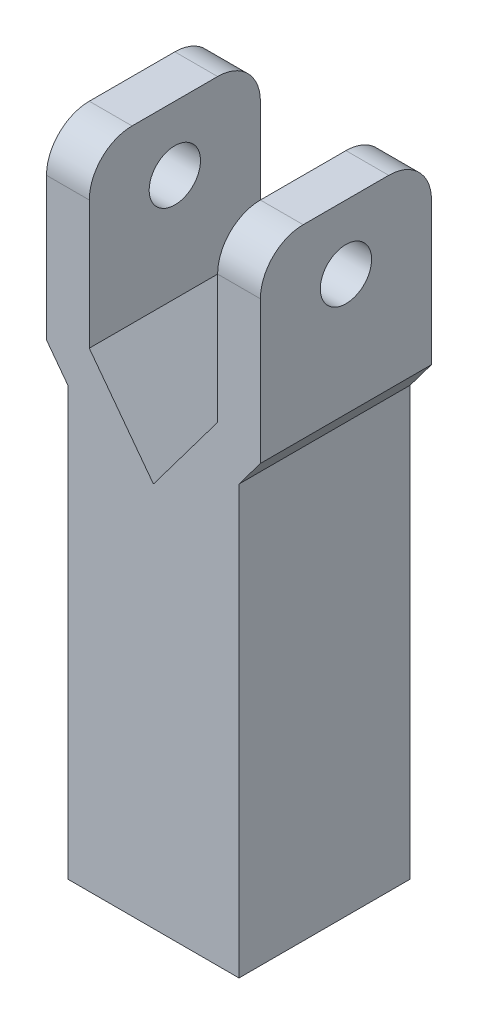
ISO-10303-21;
HEADER;
FILE_DESCRIPTION(('STEP AP214'),'2;1');
FILE_NAME('part.step','',(''),(''),'','','');
FILE_SCHEMA(('AUTOMOTIVE_DESIGN { 1 0 10303 214 1 1 1 1 }'));
ENDSEC;
DATA;
#1=APPLICATION_CONTEXT('core data for automotive mechanical design processes');
#2=APPLICATION_PROTOCOL_DEFINITION('international standard','automotive_design',2000,#1);
#3=PRODUCT_CONTEXT('',#1,'mechanical');
#4=PRODUCT('Part','Part','',(#3));
#5=PRODUCT_RELATED_PRODUCT_CATEGORY('part','',(#4));
#6=PRODUCT_DEFINITION_FORMATION('','',#4);
#7=PRODUCT_DEFINITION_CONTEXT('part definition',#1,'design');
#8=PRODUCT_DEFINITION('design','',#6,#7);
#9=PRODUCT_DEFINITION_SHAPE('','',#8);
#10=(LENGTH_UNIT() NAMED_UNIT(*) SI_UNIT(.MILLI.,.METRE.));
#11=(NAMED_UNIT(*) PLANE_ANGLE_UNIT() SI_UNIT($,.RADIAN.));
#12=(NAMED_UNIT(*) SI_UNIT($,.STERADIAN.) SOLID_ANGLE_UNIT());
#13=UNCERTAINTY_MEASURE_WITH_UNIT(LENGTH_MEASURE(1.E-05),#10,'distance_accuracy_value','');
#14=(GEOMETRIC_REPRESENTATION_CONTEXT(3) GLOBAL_UNCERTAINTY_ASSIGNED_CONTEXT((#13)) GLOBAL_UNIT_ASSIGNED_CONTEXT((#10,
#11,#12)) REPRESENTATION_CONTEXT('',''));
#15=CARTESIAN_POINT('',(0.,0.,0.));
#16=DIRECTION('',(0.,0.,1.));
#17=DIRECTION('',(1.,0.,0.));
#18=AXIS2_PLACEMENT_3D('',#15,#16,#17);
#19=CARTESIAN_POINT('',(-15.,150.,20.));
#20=DIRECTION('',(0.,-1.,0.));
#21=DIRECTION('',(0.,0.,-1.));
#22=AXIS2_PLACEMENT_3D('',#19,#20,#21);
#23=PLANE('',#22);
#24=DIRECTION('',(0.,0.,-1.));
#25=VECTOR('',#24,1.);
#26=CARTESIAN_POINT('',(-15.,150.,20.));
#27=LINE('',#26,#25);
#28=CARTESIAN_POINT('',(-15.,150.,10.));
#29=VERTEX_POINT('',#28);
#30=CARTESIAN_POINT('',(-15.,150.,-10.));
#31=VERTEX_POINT('',#30);
#32=EDGE_CURVE('E212',#29,#31,#27,.T.);
#33=ORIENTED_EDGE('',*,*,#32,.T.);
#34=DIRECTION('',(-1.,0.,0.));
#35=VECTOR('',#34,1.);
#36=CARTESIAN_POINT('',(-15.,150.,-10.));
#37=LINE('',#36,#35);
#38=CARTESIAN_POINT('',(-25.,150.,-10.));
#39=VERTEX_POINT('',#38);
#40=EDGE_CURVE('E265',#31,#39,#37,.T.);
#41=ORIENTED_EDGE('',*,*,#40,.T.);
#42=DIRECTION('',(0.,0.,-1.));
#43=VECTOR('',#42,1.);
#44=CARTESIAN_POINT('',(-25.,150.,20.));
#45=LINE('',#44,#43);
#46=CARTESIAN_POINT('',(-25.,150.,10.));
#47=VERTEX_POINT('',#46);
#48=EDGE_CURVE('E237',#47,#39,#45,.T.);
#49=ORIENTED_EDGE('',*,*,#48,.F.);
#50=DIRECTION('',(-1.,0.,0.));
#51=VECTOR('',#50,1.);
#52=CARTESIAN_POINT('',(-15.,150.,10.));
#53=LINE('',#52,#51);
#54=EDGE_CURVE('E56',#47,#29,#53,.F.);
#55=ORIENTED_EDGE('',*,*,#54,.T.);
#56=EDGE_LOOP('',(#33,#41,#49,#55));
#57=FACE_BOUND('',#56,.T.);
#58=ADVANCED_FACE('F36',(#57),#23,.F.);
#59=CARTESIAN_POINT('',(-25.,150.,20.));
#60=DIRECTION('',(1.,0.,0.));
#61=DIRECTION('',(0.,1.,0.));
#62=AXIS2_PLACEMENT_3D('',#59,#60,#61);
#63=PLANE('',#62);
#64=CARTESIAN_POINT('',(-25.,135.,0.));
#65=DIRECTION('',(-1.,0.,0.));
#66=DIRECTION('',(0.,-1.,0.));
#67=AXIS2_PLACEMENT_3D('',#64,#65,#66);
#68=CIRCLE('',#67,6.);
#69=CARTESIAN_POINT('',(-25.,129.,0.));
#70=VERTEX_POINT('',#69);
#71=EDGE_CURVE('E184',#70,#70,#68,.T.);
#72=ORIENTED_EDGE('',*,*,#71,.F.);
#73=EDGE_LOOP('',(#72));
#74=FACE_BOUND('',#73,.T.);
#75=ORIENTED_EDGE('',*,*,#48,.T.);
#76=CARTESIAN_POINT('',(-25.,140.,-10.));
#77=DIRECTION('',(1.,0.,0.));
#78=DIRECTION('',(0.,1.,0.));
#79=AXIS2_PLACEMENT_3D('',#76,#77,#78);
#80=CIRCLE('',#79,10.);
#81=CARTESIAN_POINT('',(-25.,140.,-20.));
#82=VERTEX_POINT('',#81);
#83=EDGE_CURVE('E270',#39,#82,#80,.F.);
#84=ORIENTED_EDGE('',*,*,#83,.T.);
#85=DIRECTION('',(0.,-1.,0.));
#86=VECTOR('',#85,1.);
#87=CARTESIAN_POINT('',(-25.,150.,-20.));
#88=LINE('',#87,#86);
#89=CARTESIAN_POINT('',(-25.,106.666666666667,-20.));
#90=VERTEX_POINT('',#89);
#91=EDGE_CURVE('E213',#82,#90,#88,.T.);
#92=ORIENTED_EDGE('',*,*,#91,.T.);
#93=DIRECTION('',(0.,0.,-1.));
#94=VECTOR('',#93,1.);
#95=CARTESIAN_POINT('',(-25.,106.666666666667,20.));
#96=LINE('',#95,#94);
#97=CARTESIAN_POINT('',(-25.,106.666666666667,20.));
#98=VERTEX_POINT('',#97);
#99=EDGE_CURVE('E234',#98,#90,#96,.T.);
#100=ORIENTED_EDGE('',*,*,#99,.F.);
#101=DIRECTION('',(0.,-1.,0.));
#102=VECTOR('',#101,1.);
#103=CARTESIAN_POINT('',(-25.,150.,20.));
#104=LINE('',#103,#102);
#105=CARTESIAN_POINT('',(-25.,140.,20.));
#106=VERTEX_POINT('',#105);
#107=EDGE_CURVE('E198',#106,#98,#104,.T.);
#108=ORIENTED_EDGE('',*,*,#107,.F.);
#109=CARTESIAN_POINT('',(-25.,140.,10.));
#110=DIRECTION('',(1.,0.,0.));
#111=DIRECTION('',(0.,1.,0.));
#112=AXIS2_PLACEMENT_3D('',#109,#110,#111);
#113=CIRCLE('',#112,10.);
#114=EDGE_CURVE('E268',#106,#47,#113,.F.);
#115=ORIENTED_EDGE('',*,*,#114,.T.);
#116=EDGE_LOOP('',(#75,#84,#92,#100,#108,#115));
#117=FACE_BOUND('',#116,.T.);
#118=ADVANCED_FACE('F280',(#74,#117),#63,.F.);
#119=CARTESIAN_POINT('',(-25.,106.666666666667,20.));
#120=DIRECTION('',(0.800000000000001,0.599999999999999,0.));
#121=DIRECTION('',(-0.599999999999999,0.800000000000001,0.));
#122=AXIS2_PLACEMENT_3D('',#119,#120,#121);
#123=PLANE('',#122);
#124=DIRECTION('',(0.599999999999999,-0.800000000000001,0.));
#125=VECTOR('',#124,1.);
#126=CARTESIAN_POINT('',(-25.,106.666666666667,-20.));
#127=LINE('',#126,#125);
#128=CARTESIAN_POINT('',(-20.,100.,-20.));
#129=VERTEX_POINT('',#128);
#130=EDGE_CURVE('E215',#90,#129,#127,.T.);
#131=ORIENTED_EDGE('',*,*,#130,.T.);
#132=DIRECTION('',(0.,0.,-1.));
#133=VECTOR('',#132,1.);
#134=CARTESIAN_POINT('',(-20.,100.,20.));
#135=LINE('',#134,#133);
#136=CARTESIAN_POINT('',(-20.,100.,20.));
#137=VERTEX_POINT('',#136);
#138=EDGE_CURVE('E231',#137,#129,#135,.T.);
#139=ORIENTED_EDGE('',*,*,#138,.F.);
#140=DIRECTION('',(0.599999999999999,-0.800000000000001,0.));
#141=VECTOR('',#140,1.);
#142=CARTESIAN_POINT('',(-25.,106.666666666667,20.));
#143=LINE('',#142,#141);
#144=EDGE_CURVE('E200',#98,#137,#143,.T.);
#145=ORIENTED_EDGE('',*,*,#144,.F.);
#146=ORIENTED_EDGE('',*,*,#99,.T.);
#147=EDGE_LOOP('',(#131,#139,#145,#146));
#148=FACE_BOUND('',#147,.T.);
#149=ADVANCED_FACE('F296',(#148),#123,.F.);
#150=CARTESIAN_POINT('',(-20.,100.,20.));
#151=DIRECTION('',(1.,0.,0.));
#152=DIRECTION('',(0.,1.,0.));
#153=AXIS2_PLACEMENT_3D('',#150,#151,#152);
#154=PLANE('',#153);
#155=DIRECTION('',(0.,-1.,0.));
#156=VECTOR('',#155,1.);
#157=CARTESIAN_POINT('',(-20.,100.,-20.));
#158=LINE('',#157,#156);
#159=CARTESIAN_POINT('',(-20.,0.,-20.));
#160=VERTEX_POINT('',#159);
#161=EDGE_CURVE('E217',#129,#160,#158,.T.);
#162=ORIENTED_EDGE('',*,*,#161,.T.);
#163=DIRECTION('',(0.,0.,-1.));
#164=VECTOR('',#163,1.);
#165=CARTESIAN_POINT('',(-20.,0.,20.));
#166=LINE('',#165,#164);
#167=CARTESIAN_POINT('',(-20.,0.,20.));
#168=VERTEX_POINT('',#167);
#169=EDGE_CURVE('E228',#168,#160,#166,.T.);
#170=ORIENTED_EDGE('',*,*,#169,.F.);
#171=DIRECTION('',(0.,-1.,0.));
#172=VECTOR('',#171,1.);
#173=CARTESIAN_POINT('',(-20.,100.,20.));
#174=LINE('',#173,#172);
#175=EDGE_CURVE('E203',#137,#168,#174,.T.);
#176=ORIENTED_EDGE('',*,*,#175,.F.);
#177=ORIENTED_EDGE('',*,*,#138,.T.);
#178=EDGE_LOOP('',(#162,#170,#176,#177));
#179=FACE_BOUND('',#178,.T.);
#180=ADVANCED_FACE('F300',(#179),#154,.F.);
#181=CARTESIAN_POINT('',(-20.,0.,20.));
#182=DIRECTION('',(0.,1.,0.));
#183=DIRECTION('',(0.,0.,1.));
#184=AXIS2_PLACEMENT_3D('',#181,#182,#183);
#185=PLANE('',#184);
#186=DIRECTION('',(1.,0.,0.));
#187=VECTOR('',#186,1.);
#188=CARTESIAN_POINT('',(-20.,0.,-20.));
#189=LINE('',#188,#187);
#190=CARTESIAN_POINT('',(20.,0.,-20.));
#191=VERTEX_POINT('',#190);
#192=EDGE_CURVE('E219',#160,#191,#189,.T.);
#193=ORIENTED_EDGE('',*,*,#192,.T.);
#194=DIRECTION('',(0.,0.,-1.));
#195=VECTOR('',#194,1.);
#196=CARTESIAN_POINT('',(20.,0.,20.));
#197=LINE('',#196,#195);
#198=CARTESIAN_POINT('',(20.,0.,20.));
#199=VERTEX_POINT('',#198);
#200=EDGE_CURVE('E186',#199,#191,#197,.T.);
#201=ORIENTED_EDGE('',*,*,#200,.F.);
#202=DIRECTION('',(1.,0.,0.));
#203=VECTOR('',#202,1.);
#204=CARTESIAN_POINT('',(-20.,0.,20.));
#205=LINE('',#204,#203);
#206=EDGE_CURVE('E205',#168,#199,#205,.T.);
#207=ORIENTED_EDGE('',*,*,#206,.F.);
#208=ORIENTED_EDGE('',*,*,#169,.T.);
#209=EDGE_LOOP('',(#193,#201,#207,#208));
#210=FACE_BOUND('',#209,.T.);
#211=ADVANCED_FACE('F306',(#210),#185,.F.);
#212=CARTESIAN_POINT('',(-15.,110.,20.));
#213=DIRECTION('',(-0.8,-0.599999999999999,0.));
#214=DIRECTION('',(0.6,-0.800000000000001,0.));
#215=AXIS2_PLACEMENT_3D('',#212,#213,#214);
#216=PLANE('',#215);
#217=DIRECTION('',(-0.599999999999999,0.8,0.));
#218=VECTOR('',#217,1.);
#219=CARTESIAN_POINT('',(-15.,110.,-20.));
#220=LINE('',#219,#218);
#221=CARTESIAN_POINT('',(0.,90.,-20.));
#222=VERTEX_POINT('',#221);
#223=CARTESIAN_POINT('',(-15.,110.,-20.));
#224=VERTEX_POINT('',#223);
#225=EDGE_CURVE('E221',#222,#224,#220,.T.);
#226=ORIENTED_EDGE('',*,*,#225,.T.);
#227=DIRECTION('',(0.,0.,-1.));
#228=VECTOR('',#227,1.);
#229=CARTESIAN_POINT('',(-15.,110.,20.));
#230=LINE('',#229,#228);
#231=CARTESIAN_POINT('',(-15.,110.,20.));
#232=VERTEX_POINT('',#231);
#233=EDGE_CURVE('E225',#232,#224,#230,.T.);
#234=ORIENTED_EDGE('',*,*,#233,.F.);
#235=DIRECTION('',(-0.599999999999999,0.8,0.));
#236=VECTOR('',#235,1.);
#237=CARTESIAN_POINT('',(-15.,110.,20.));
#238=LINE('',#237,#236);
#239=CARTESIAN_POINT('',(0.,90.,20.));
#240=VERTEX_POINT('',#239);
#241=EDGE_CURVE('E207',#240,#232,#238,.T.);
#242=ORIENTED_EDGE('',*,*,#241,.F.);
#243=DIRECTION('',(0.,0.,-1.));
#244=VECTOR('',#243,1.);
#245=CARTESIAN_POINT('',(0.,90.,20.));
#246=LINE('',#245,#244);
#247=EDGE_CURVE('E309',#240,#222,#246,.T.);
#248=ORIENTED_EDGE('',*,*,#247,.T.);
#249=EDGE_LOOP('',(#226,#234,#242,#248));
#250=FACE_BOUND('',#249,.T.);
#251=ADVANCED_FACE('F336',(#250),#216,.F.);
#252=CARTESIAN_POINT('',(-15.,150.,20.));
#253=DIRECTION('',(-1.,0.,0.));
#254=DIRECTION('',(0.,-1.,0.));
#255=AXIS2_PLACEMENT_3D('',#252,#253,#254);
#256=PLANE('',#255);
#257=CARTESIAN_POINT('',(-15.,135.,0.));
#258=DIRECTION('',(-1.,0.,0.));
#259=DIRECTION('',(0.,-1.,0.));
#260=AXIS2_PLACEMENT_3D('',#257,#258,#259);
#261=CIRCLE('',#260,6.);
#262=CARTESIAN_POINT('',(-15.,129.,0.));
#263=VERTEX_POINT('',#262);
#264=EDGE_CURVE('E197',#263,#263,#261,.T.);
#265=ORIENTED_EDGE('',*,*,#264,.T.);
#266=EDGE_LOOP('',(#265));
#267=FACE_BOUND('',#266,.T.);
#268=DIRECTION('',(0.,1.,0.));
#269=VECTOR('',#268,1.);
#270=CARTESIAN_POINT('',(-15.,150.,-20.));
#271=LINE('',#270,#269);
#272=CARTESIAN_POINT('',(-15.,140.,-20.));
#273=VERTEX_POINT('',#272);
#274=EDGE_CURVE('E201',#224,#273,#271,.T.);
#275=ORIENTED_EDGE('',*,*,#274,.T.);
#276=CARTESIAN_POINT('',(-15.,140.,-10.));
#277=DIRECTION('',(-1.,0.,0.));
#278=DIRECTION('',(0.,-1.,0.));
#279=AXIS2_PLACEMENT_3D('',#276,#277,#278);
#280=CIRCLE('',#279,10.);
#281=EDGE_CURVE('E11',#273,#31,#280,.F.);
#282=ORIENTED_EDGE('',*,*,#281,.T.);
#283=ORIENTED_EDGE('',*,*,#32,.F.);
#284=CARTESIAN_POINT('',(-15.,140.,10.));
#285=DIRECTION('',(-1.,0.,0.));
#286=DIRECTION('',(0.,-1.,0.));
#287=AXIS2_PLACEMENT_3D('',#284,#285,#286);
#288=CIRCLE('',#287,10.);
#289=CARTESIAN_POINT('',(-15.,140.,20.));
#290=VERTEX_POINT('',#289);
#291=EDGE_CURVE('E44',#29,#290,#288,.F.);
#292=ORIENTED_EDGE('',*,*,#291,.T.);
#293=DIRECTION('',(0.,1.,0.));
#294=VECTOR('',#293,1.);
#295=CARTESIAN_POINT('',(-15.,150.,20.));
#296=LINE('',#295,#294);
#297=EDGE_CURVE('E209',#232,#290,#296,.T.);
#298=ORIENTED_EDGE('',*,*,#297,.F.);
#299=ORIENTED_EDGE('',*,*,#233,.T.);
#300=EDGE_LOOP('',(#275,#282,#283,#292,#298,#299));
#301=FACE_BOUND('',#300,.T.);
#302=ADVANCED_FACE('F273',(#267,#301),#256,.F.);
#303=CARTESIAN_POINT('',(-25.,150.,20.));
#304=DIRECTION('',(0.,0.,1.));
#305=DIRECTION('',(1.,0.,0.));
#306=AXIS2_PLACEMENT_3D('',#303,#304,#305);
#307=PLANE('',#306);
#308=DIRECTION('',(0.,-1.,0.));
#309=VECTOR('',#308,1.);
#310=CARTESIAN_POINT('',(25.,150.,20.));
#311=LINE('',#310,#309);
#312=CARTESIAN_POINT('',(25.,140.,20.));
#313=VERTEX_POINT('',#312);
#314=CARTESIAN_POINT('',(25.,106.666666666667,20.));
#315=VERTEX_POINT('',#314);
#316=EDGE_CURVE('E155',#313,#315,#311,.T.);
#317=ORIENTED_EDGE('',*,*,#316,.F.);
#318=DIRECTION('',(1.,0.,0.));
#319=VECTOR('',#318,1.);
#320=CARTESIAN_POINT('',(15.,140.,20.));
#321=LINE('',#320,#319);
#322=CARTESIAN_POINT('',(15.,140.,20.));
#323=VERTEX_POINT('',#322);
#324=EDGE_CURVE('E262',#313,#323,#321,.F.);
#325=ORIENTED_EDGE('',*,*,#324,.T.);
#326=DIRECTION('',(0.,1.,0.));
#327=VECTOR('',#326,1.);
#328=CARTESIAN_POINT('',(15.,150.,20.));
#329=LINE('',#328,#327);
#330=CARTESIAN_POINT('',(15.,110.,20.));
#331=VERTEX_POINT('',#330);
#332=EDGE_CURVE('E314',#331,#323,#329,.T.);
#333=ORIENTED_EDGE('',*,*,#332,.F.);
#334=DIRECTION('',(0.599999999999999,0.8,0.));
#335=VECTOR('',#334,1.);
#336=CARTESIAN_POINT('',(15.,110.,20.));
#337=LINE('',#336,#335);
#338=EDGE_CURVE('E311',#240,#331,#337,.T.);
#339=ORIENTED_EDGE('',*,*,#338,.F.);
#340=ORIENTED_EDGE('',*,*,#241,.T.);
#341=ORIENTED_EDGE('',*,*,#297,.T.);
#342=DIRECTION('',(-1.,0.,0.));
#343=VECTOR('',#342,1.);
#344=CARTESIAN_POINT('',(-25.,140.,20.));
#345=LINE('',#344,#343);
#346=EDGE_CURVE('E259',#290,#106,#345,.T.);
#347=ORIENTED_EDGE('',*,*,#346,.T.);
#348=ORIENTED_EDGE('',*,*,#107,.T.);
#349=ORIENTED_EDGE('',*,*,#144,.T.);
#350=ORIENTED_EDGE('',*,*,#175,.T.);
#351=ORIENTED_EDGE('',*,*,#206,.T.);
#352=DIRECTION('',(0.,-1.,0.));
#353=VECTOR('',#352,1.);
#354=CARTESIAN_POINT('',(20.,100.,20.));
#355=LINE('',#354,#353);
#356=CARTESIAN_POINT('',(20.,100.,20.));
#357=VERTEX_POINT('',#356);
#358=EDGE_CURVE('E171',#357,#199,#355,.T.);
#359=ORIENTED_EDGE('',*,*,#358,.F.);
#360=DIRECTION('',(-0.599999999999999,-0.800000000000001,0.));
#361=VECTOR('',#360,1.);
#362=CARTESIAN_POINT('',(25.,106.666666666667,20.));
#363=LINE('',#362,#361);
#364=EDGE_CURVE('E165',#315,#357,#363,.T.);
#365=ORIENTED_EDGE('',*,*,#364,.F.);
#366=EDGE_LOOP('',(#317,#325,#333,#339,#340,#341,#347,#348,#349,#350,#351,#359,#365));
#367=FACE_BOUND('',#366,.T.);
#368=ADVANCED_FACE('F169',(#367),#307,.T.);
#369=CARTESIAN_POINT('',(-25.,150.,-20.));
#370=DIRECTION('',(0.,0.,1.));
#371=DIRECTION('',(1.,0.,0.));
#372=AXIS2_PLACEMENT_3D('',#369,#370,#371);
#373=PLANE('',#372);
#374=DIRECTION('',(0.,1.,0.));
#375=VECTOR('',#374,1.);
#376=CARTESIAN_POINT('',(15.,150.,-20.));
#377=LINE('',#376,#375);
#378=CARTESIAN_POINT('',(15.,110.,-20.));
#379=VERTEX_POINT('',#378);
#380=CARTESIAN_POINT('',(15.,140.,-20.));
#381=VERTEX_POINT('',#380);
#382=EDGE_CURVE('E166',#379,#381,#377,.T.);
#383=ORIENTED_EDGE('',*,*,#382,.T.);
#384=DIRECTION('',(1.,0.,0.));
#385=VECTOR('',#384,1.);
#386=CARTESIAN_POINT('',(-25.,140.,-20.));
#387=LINE('',#386,#385);
#388=CARTESIAN_POINT('',(25.,140.,-20.));
#389=VERTEX_POINT('',#388);
#390=EDGE_CURVE('E244',#381,#389,#387,.T.);
#391=ORIENTED_EDGE('',*,*,#390,.T.);
#392=DIRECTION('',(0.,-1.,0.));
#393=VECTOR('',#392,1.);
#394=CARTESIAN_POINT('',(25.,150.,-20.));
#395=LINE('',#394,#393);
#396=CARTESIAN_POINT('',(25.,106.666666666667,-20.));
#397=VERTEX_POINT('',#396);
#398=EDGE_CURVE('E193',#389,#397,#395,.T.);
#399=ORIENTED_EDGE('',*,*,#398,.T.);
#400=DIRECTION('',(-0.599999999999999,-0.800000000000001,0.));
#401=VECTOR('',#400,1.);
#402=CARTESIAN_POINT('',(25.,106.666666666667,-20.));
#403=LINE('',#402,#401);
#404=CARTESIAN_POINT('',(20.,100.,-20.));
#405=VERTEX_POINT('',#404);
#406=EDGE_CURVE('E179',#397,#405,#403,.T.);
#407=ORIENTED_EDGE('',*,*,#406,.T.);
#408=DIRECTION('',(0.,-1.,0.));
#409=VECTOR('',#408,1.);
#410=CARTESIAN_POINT('',(20.,100.,-20.));
#411=LINE('',#410,#409);
#412=EDGE_CURVE('E322',#405,#191,#411,.T.);
#413=ORIENTED_EDGE('',*,*,#412,.T.);
#414=ORIENTED_EDGE('',*,*,#192,.F.);
#415=ORIENTED_EDGE('',*,*,#161,.F.);
#416=ORIENTED_EDGE('',*,*,#130,.F.);
#417=ORIENTED_EDGE('',*,*,#91,.F.);
#418=DIRECTION('',(-1.,0.,0.));
#419=VECTOR('',#418,1.);
#420=CARTESIAN_POINT('',(-25.,140.,-20.));
#421=LINE('',#420,#419);
#422=EDGE_CURVE('E240',#82,#273,#421,.F.);
#423=ORIENTED_EDGE('',*,*,#422,.T.);
#424=ORIENTED_EDGE('',*,*,#274,.F.);
#425=ORIENTED_EDGE('',*,*,#225,.F.);
#426=DIRECTION('',(0.599999999999999,0.8,0.));
#427=VECTOR('',#426,1.);
#428=CARTESIAN_POINT('',(15.,110.,-20.));
#429=LINE('',#428,#427);
#430=EDGE_CURVE('E324',#222,#379,#429,.T.);
#431=ORIENTED_EDGE('',*,*,#430,.T.);
#432=EDGE_LOOP('',(#383,#391,#399,#407,#413,#414,#415,#416,#417,#423,#424,#425,#431));
#433=FACE_BOUND('',#432,.T.);
#434=ADVANCED_FACE('F290',(#433),#373,.F.);
#435=CARTESIAN_POINT('',(15.,135.,0.));
#436=DIRECTION('',(-1.,0.,0.));
#437=DIRECTION('',(0.,-1.,0.));
#438=AXIS2_PLACEMENT_3D('',#435,#436,#437);
#439=CYLINDRICAL_SURFACE('',#438,6.);
#440=ORIENTED_EDGE('',*,*,#71,.T.);
#441=EDGE_LOOP('',(#440));
#442=FACE_BOUND('',#441,.T.);
#443=ORIENTED_EDGE('',*,*,#264,.F.);
#444=EDGE_LOOP('',(#443));
#445=FACE_BOUND('',#444,.T.);
#446=ADVANCED_FACE('F384',(#442,#445),#439,.F.);
#447=CARTESIAN_POINT('',(15.,150.,20.));
#448=DIRECTION('',(0.,-1.,0.));
#449=DIRECTION('',(0.,0.,-1.));
#450=AXIS2_PLACEMENT_3D('',#447,#448,#449);
#451=PLANE('',#450);
#452=DIRECTION('',(0.,0.,-1.));
#453=VECTOR('',#452,1.);
#454=CARTESIAN_POINT('',(25.,150.,20.));
#455=LINE('',#454,#453);
#456=CARTESIAN_POINT('',(25.,150.,10.));
#457=VERTEX_POINT('',#456);
#458=CARTESIAN_POINT('',(25.,150.,-10.));
#459=VERTEX_POINT('',#458);
#460=EDGE_CURVE('E180',#457,#459,#455,.T.);
#461=ORIENTED_EDGE('',*,*,#460,.T.);
#462=DIRECTION('',(1.,0.,0.));
#463=VECTOR('',#462,1.);
#464=CARTESIAN_POINT('',(15.,150.,-10.));
#465=LINE('',#464,#463);
#466=CARTESIAN_POINT('',(15.,150.,-10.));
#467=VERTEX_POINT('',#466);
#468=EDGE_CURVE('E253',#459,#467,#465,.F.);
#469=ORIENTED_EDGE('',*,*,#468,.T.);
#470=DIRECTION('',(0.,0.,-1.));
#471=VECTOR('',#470,1.);
#472=CARTESIAN_POINT('',(15.,150.,20.));
#473=LINE('',#472,#471);
#474=CARTESIAN_POINT('',(15.,150.,10.));
#475=VERTEX_POINT('',#474);
#476=EDGE_CURVE('E319',#475,#467,#473,.T.);
#477=ORIENTED_EDGE('',*,*,#476,.F.);
#478=DIRECTION('',(1.,0.,0.));
#479=VECTOR('',#478,1.);
#480=CARTESIAN_POINT('',(25.,150.,10.));
#481=LINE('',#480,#479);
#482=EDGE_CURVE('E250',#475,#457,#481,.T.);
#483=ORIENTED_EDGE('',*,*,#482,.T.);
#484=EDGE_LOOP('',(#461,#469,#477,#483));
#485=FACE_BOUND('',#484,.T.);
#486=ADVANCED_FACE('F350',(#485),#451,.F.);
#487=CARTESIAN_POINT('',(25.,150.,20.));
#488=DIRECTION('',(-1.,0.,0.));
#489=DIRECTION('',(0.,1.,0.));
#490=AXIS2_PLACEMENT_3D('',#487,#488,#489);
#491=PLANE('',#490);
#492=CARTESIAN_POINT('',(25.,135.,0.));
#493=DIRECTION('',(-1.,0.,0.));
#494=DIRECTION('',(0.,-1.,0.));
#495=AXIS2_PLACEMENT_3D('',#492,#493,#494);
#496=CIRCLE('',#495,6.);
#497=CARTESIAN_POINT('',(25.,129.,0.));
#498=VERTEX_POINT('',#497);
#499=EDGE_CURVE('E194',#498,#498,#496,.T.);
#500=ORIENTED_EDGE('',*,*,#499,.T.);
#501=EDGE_LOOP('',(#500));
#502=FACE_BOUND('',#501,.T.);
#503=ORIENTED_EDGE('',*,*,#398,.F.);
#504=CARTESIAN_POINT('',(25.,140.,-10.));
#505=DIRECTION('',(-1.,0.,0.));
#506=DIRECTION('',(0.,-1.,0.));
#507=AXIS2_PLACEMENT_3D('',#504,#505,#506);
#508=CIRCLE('',#507,10.);
#509=EDGE_CURVE('E248',#389,#459,#508,.F.);
#510=ORIENTED_EDGE('',*,*,#509,.T.);
#511=ORIENTED_EDGE('',*,*,#460,.F.);
#512=CARTESIAN_POINT('',(25.,140.,10.));
#513=DIRECTION('',(-1.,0.,0.));
#514=DIRECTION('',(0.,-1.,0.));
#515=AXIS2_PLACEMENT_3D('',#512,#513,#514);
#516=CIRCLE('',#515,10.);
#517=EDGE_CURVE('E162',#457,#313,#516,.F.);
#518=ORIENTED_EDGE('',*,*,#517,.T.);
#519=ORIENTED_EDGE('',*,*,#316,.T.);
#520=DIRECTION('',(0.,0.,-1.));
#521=VECTOR('',#520,1.);
#522=CARTESIAN_POINT('',(25.,106.666666666667,20.));
#523=LINE('',#522,#521);
#524=EDGE_CURVE('E160',#315,#397,#523,.T.);
#525=ORIENTED_EDGE('',*,*,#524,.T.);
#526=EDGE_LOOP('',(#503,#510,#511,#518,#519,#525));
#527=FACE_BOUND('',#526,.T.);
#528=ADVANCED_FACE('F158',(#502,#527),#491,.F.);
#529=CARTESIAN_POINT('',(25.,106.666666666667,20.));
#530=DIRECTION('',(-0.800000000000001,0.599999999999999,0.));
#531=DIRECTION('',(0.599999999999999,0.800000000000001,0.));
#532=AXIS2_PLACEMENT_3D('',#529,#530,#531);
#533=PLANE('',#532);
#534=ORIENTED_EDGE('',*,*,#406,.F.);
#535=ORIENTED_EDGE('',*,*,#524,.F.);
#536=ORIENTED_EDGE('',*,*,#364,.T.);
#537=DIRECTION('',(0.,0.,-1.));
#538=VECTOR('',#537,1.);
#539=CARTESIAN_POINT('',(20.,100.,20.));
#540=LINE('',#539,#538);
#541=EDGE_CURVE('E181',#357,#405,#540,.T.);
#542=ORIENTED_EDGE('',*,*,#541,.T.);
#543=EDGE_LOOP('',(#534,#535,#536,#542));
#544=FACE_BOUND('',#543,.T.);
#545=ADVANCED_FACE('F177',(#544),#533,.F.);
#546=CARTESIAN_POINT('',(20.,100.,20.));
#547=DIRECTION('',(-1.,0.,0.));
#548=DIRECTION('',(0.,1.,0.));
#549=AXIS2_PLACEMENT_3D('',#546,#547,#548);
#550=PLANE('',#549);
#551=ORIENTED_EDGE('',*,*,#412,.F.);
#552=ORIENTED_EDGE('',*,*,#541,.F.);
#553=ORIENTED_EDGE('',*,*,#358,.T.);
#554=ORIENTED_EDGE('',*,*,#200,.T.);
#555=EDGE_LOOP('',(#551,#552,#553,#554));
#556=FACE_BOUND('',#555,.T.);
#557=ADVANCED_FACE('F310',(#556),#550,.F.);
#558=CARTESIAN_POINT('',(15.,110.,20.));
#559=DIRECTION('',(0.8,-0.599999999999999,0.));
#560=DIRECTION('',(-0.6,-0.800000000000001,0.));
#561=AXIS2_PLACEMENT_3D('',#558,#559,#560);
#562=PLANE('',#561);
#563=ORIENTED_EDGE('',*,*,#430,.F.);
#564=ORIENTED_EDGE('',*,*,#247,.F.);
#565=ORIENTED_EDGE('',*,*,#338,.T.);
#566=DIRECTION('',(0.,0.,-1.));
#567=VECTOR('',#566,1.);
#568=CARTESIAN_POINT('',(15.,110.,20.));
#569=LINE('',#568,#567);
#570=EDGE_CURVE('E330',#331,#379,#569,.T.);
#571=ORIENTED_EDGE('',*,*,#570,.T.);
#572=EDGE_LOOP('',(#563,#564,#565,#571));
#573=FACE_BOUND('',#572,.T.);
#574=ADVANCED_FACE('F339',(#573),#562,.F.);
#575=CARTESIAN_POINT('',(15.,150.,20.));
#576=DIRECTION('',(1.,0.,0.));
#577=DIRECTION('',(0.,-1.,0.));
#578=AXIS2_PLACEMENT_3D('',#575,#576,#577);
#579=PLANE('',#578);
#580=CARTESIAN_POINT('',(15.,135.,0.));
#581=DIRECTION('',(-1.,0.,0.));
#582=DIRECTION('',(0.,-1.,0.));
#583=AXIS2_PLACEMENT_3D('',#580,#581,#582);
#584=CIRCLE('',#583,6.);
#585=CARTESIAN_POINT('',(15.,129.,0.));
#586=VERTEX_POINT('',#585);
#587=EDGE_CURVE('E190',#586,#586,#584,.T.);
#588=ORIENTED_EDGE('',*,*,#587,.F.);
#589=EDGE_LOOP('',(#588));
#590=FACE_BOUND('',#589,.T.);
#591=ORIENTED_EDGE('',*,*,#476,.T.);
#592=CARTESIAN_POINT('',(15.,140.,-10.));
#593=DIRECTION('',(1.,0.,0.));
#594=DIRECTION('',(0.,1.,0.));
#595=AXIS2_PLACEMENT_3D('',#592,#593,#594);
#596=CIRCLE('',#595,10.);
#597=EDGE_CURVE('E257',#467,#381,#596,.F.);
#598=ORIENTED_EDGE('',*,*,#597,.T.);
#599=ORIENTED_EDGE('',*,*,#382,.F.);
#600=ORIENTED_EDGE('',*,*,#570,.F.);
#601=ORIENTED_EDGE('',*,*,#332,.T.);
#602=CARTESIAN_POINT('',(15.,140.,10.));
#603=DIRECTION('',(1.,0.,0.));
#604=DIRECTION('',(0.,1.,0.));
#605=AXIS2_PLACEMENT_3D('',#602,#603,#604);
#606=CIRCLE('',#605,10.);
#607=EDGE_CURVE('E255',#323,#475,#606,.F.);
#608=ORIENTED_EDGE('',*,*,#607,.T.);
#609=EDGE_LOOP('',(#591,#598,#599,#600,#601,#608));
#610=FACE_BOUND('',#609,.T.);
#611=ADVANCED_FACE('F342',(#590,#610),#579,.F.);
#612=CARTESIAN_POINT('',(-15.,135.,0.));
#613=DIRECTION('',(1.,0.,0.));
#614=DIRECTION('',(0.,-1.,0.));
#615=AXIS2_PLACEMENT_3D('',#612,#613,#614);
#616=CYLINDRICAL_SURFACE('',#615,6.);
#617=ORIENTED_EDGE('',*,*,#499,.F.);
#618=EDGE_LOOP('',(#617));
#619=FACE_BOUND('',#618,.T.);
#620=ORIENTED_EDGE('',*,*,#587,.T.);
#621=EDGE_LOOP('',(#620));
#622=FACE_BOUND('',#621,.T.);
#623=ADVANCED_FACE('F361',(#619,#622),#616,.F.);
#624=CARTESIAN_POINT('',(-25.,140.,-10.));
#625=DIRECTION('',(1.,0.,0.));
#626=DIRECTION('',(0.,0.,-1.));
#627=AXIS2_PLACEMENT_3D('',#624,#625,#626);
#628=CYLINDRICAL_SURFACE('',#627,10.);
#629=ORIENTED_EDGE('',*,*,#597,.F.);
#630=ORIENTED_EDGE('',*,*,#468,.F.);
#631=ORIENTED_EDGE('',*,*,#509,.F.);
#632=ORIENTED_EDGE('',*,*,#390,.F.);
#633=EDGE_LOOP('',(#629,#630,#631,#632));
#634=FACE_BOUND('',#633,.T.);
#635=ADVANCED_FACE('F347',(#634),#628,.T.);
#636=CARTESIAN_POINT('',(15.,140.,10.));
#637=DIRECTION('',(-1.,0.,0.));
#638=DIRECTION('',(0.,0.,1.));
#639=AXIS2_PLACEMENT_3D('',#636,#637,#638);
#640=CYLINDRICAL_SURFACE('',#639,10.);
#641=ORIENTED_EDGE('',*,*,#607,.F.);
#642=ORIENTED_EDGE('',*,*,#324,.F.);
#643=ORIENTED_EDGE('',*,*,#517,.F.);
#644=ORIENTED_EDGE('',*,*,#482,.F.);
#645=EDGE_LOOP('',(#641,#642,#643,#644));
#646=FACE_BOUND('',#645,.T.);
#647=ADVANCED_FACE('F354',(#646),#640,.T.);
#648=CARTESIAN_POINT('',(-15.,140.,-10.));
#649=DIRECTION('',(-1.,0.,0.));
#650=DIRECTION('',(0.,0.,1.));
#651=AXIS2_PLACEMENT_3D('',#648,#649,#650);
#652=CYLINDRICAL_SURFACE('',#651,10.);
#653=ORIENTED_EDGE('',*,*,#281,.F.);
#654=ORIENTED_EDGE('',*,*,#422,.F.);
#655=ORIENTED_EDGE('',*,*,#83,.F.);
#656=ORIENTED_EDGE('',*,*,#40,.F.);
#657=EDGE_LOOP('',(#653,#654,#655,#656));
#658=FACE_BOUND('',#657,.T.);
#659=ADVANCED_FACE('F284',(#658),#652,.T.);
#660=CARTESIAN_POINT('',(-25.,140.,10.));
#661=DIRECTION('',(1.,0.,0.));
#662=DIRECTION('',(0.,0.,-1.));
#663=AXIS2_PLACEMENT_3D('',#660,#661,#662);
#664=CYLINDRICAL_SURFACE('',#663,10.);
#665=ORIENTED_EDGE('',*,*,#291,.F.);
#666=ORIENTED_EDGE('',*,*,#54,.F.);
#667=ORIENTED_EDGE('',*,*,#114,.F.);
#668=ORIENTED_EDGE('',*,*,#346,.F.);
#669=EDGE_LOOP('',(#665,#666,#667,#668));
#670=FACE_BOUND('',#669,.T.);
#671=ADVANCED_FACE('F38',(#670),#664,.T.);
#672=CLOSED_SHELL('',(#58,#118,#149,#180,#211,#251,#302,#368,#434,#446,#486,#528,#545,#557,#574,
#611,#623,#635,#647,#659,#671));
#673=MANIFOLD_SOLID_BREP('B2',#672);
#674=ADVANCED_BREP_SHAPE_REPRESENTATION('',(#18,#673),#14);
#675=SHAPE_DEFINITION_REPRESENTATION(#9,#674);
ENDSEC;
END-ISO-10303-21;
